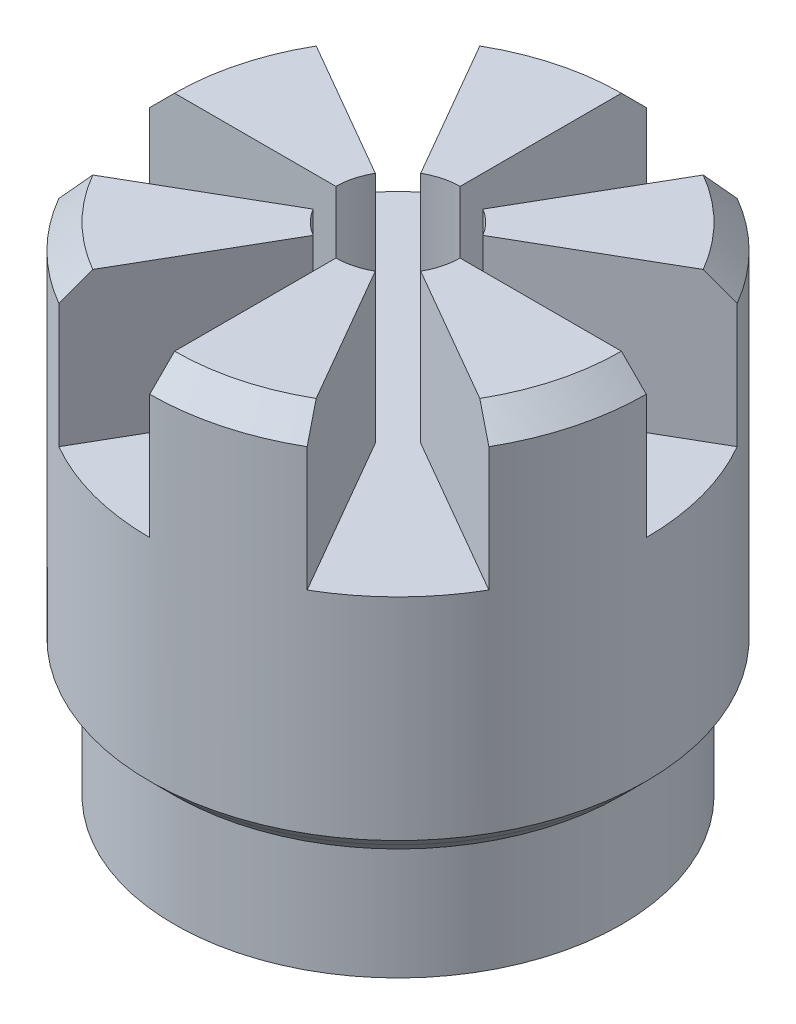
ISO-10303-21;
HEADER;
FILE_DESCRIPTION(('STEP AP214'),'2;1');
FILE_NAME('part.step','',(''),(''),'','','');
FILE_SCHEMA(('AUTOMOTIVE_DESIGN { 1 0 10303 214 1 1 1 1 }'));
ENDSEC;
DATA;
#1=APPLICATION_CONTEXT('core data for automotive mechanical design processes');
#2=APPLICATION_PROTOCOL_DEFINITION('international standard','automotive_design',2000,#1);
#3=PRODUCT_CONTEXT('',#1,'mechanical');
#4=PRODUCT('Part','Part','',(#3));
#5=PRODUCT_RELATED_PRODUCT_CATEGORY('part','',(#4));
#6=PRODUCT_DEFINITION_FORMATION('','',#4);
#7=PRODUCT_DEFINITION_CONTEXT('part definition',#1,'design');
#8=PRODUCT_DEFINITION('design','',#6,#7);
#9=PRODUCT_DEFINITION_SHAPE('','',#8);
#10=(LENGTH_UNIT() NAMED_UNIT(*) SI_UNIT(.MILLI.,.METRE.));
#11=(NAMED_UNIT(*) PLANE_ANGLE_UNIT() SI_UNIT($,.RADIAN.));
#12=(NAMED_UNIT(*) SI_UNIT($,.STERADIAN.) SOLID_ANGLE_UNIT());
#13=UNCERTAINTY_MEASURE_WITH_UNIT(LENGTH_MEASURE(1.E-05),#10,'distance_accuracy_value','');
#14=(GEOMETRIC_REPRESENTATION_CONTEXT(3) GLOBAL_UNCERTAINTY_ASSIGNED_CONTEXT((#13)) GLOBAL_UNIT_ASSIGNED_CONTEXT((#10,
#11,#12)) REPRESENTATION_CONTEXT('',''));
#15=CARTESIAN_POINT('',(0.,0.,0.));
#16=DIRECTION('',(0.,0.,1.));
#17=DIRECTION('',(1.,0.,0.));
#18=AXIS2_PLACEMENT_3D('',#15,#16,#17);
#19=CARTESIAN_POINT('',(0.,40.,0.));
#20=DIRECTION('',(0.,1.,0.));
#21=DIRECTION('',(-1.,0.,0.));
#22=AXIS2_PLACEMENT_3D('',#19,#20,#21);
#23=PLANE('',#22);
#24=CARTESIAN_POINT('',(0.,40.,0.));
#25=DIRECTION('',(0.,1.,0.));
#26=DIRECTION('',(-1.,0.,0.));
#27=AXIS2_PLACEMENT_3D('',#24,#25,#26);
#28=CIRCLE('',#27,5.);
#29=CARTESIAN_POINT('',(-4.33012701892222,40.,2.49999999999996));
#30=VERTEX_POINT('',#29);
#31=CARTESIAN_POINT('',(-2.49999999999997,40.,4.33012701892221));
#32=VERTEX_POINT('',#31);
#33=EDGE_CURVE('E241',#30,#32,#28,.T.);
#34=ORIENTED_EDGE('',*,*,#33,.F.);
#35=DIRECTION('',(-0.866025403784443,0.,0.499999999999992));
#36=VECTOR('',#35,1.);
#37=CARTESIAN_POINT('',(0.,40.,0.));
#38=LINE('',#37,#36);
#39=CARTESIAN_POINT('',(-15.58845726812,40.,8.99999999999985));
#40=VERTEX_POINT('',#39);
#41=EDGE_CURVE('E471',#30,#40,#38,.T.);
#42=ORIENTED_EDGE('',*,*,#41,.T.);
#43=CARTESIAN_POINT('',(0.,40.,0.));
#44=DIRECTION('',(0.,1.,0.));
#45=DIRECTION('',(-1.,0.,0.));
#46=AXIS2_PLACEMENT_3D('',#43,#44,#45);
#47=CIRCLE('',#46,18.);
#48=CARTESIAN_POINT('',(-8.9999999999999,40.,15.5884572681199));
#49=VERTEX_POINT('',#48);
#50=EDGE_CURVE('E464',#40,#49,#47,.T.);
#51=ORIENTED_EDGE('',*,*,#50,.T.);
#52=DIRECTION('',(0.499999999999995,0.,-0.866025403784442));
#53=VECTOR('',#52,1.);
#54=CARTESIAN_POINT('',(0.,40.,0.));
#55=LINE('',#54,#53);
#56=EDGE_CURVE('E455',#49,#32,#55,.T.);
#57=ORIENTED_EDGE('',*,*,#56,.T.);
#58=EDGE_LOOP('',(#34,#42,#51,#57));
#59=FACE_BOUND('',#58,.T.);
#60=ADVANCED_FACE('F32',(#59),#23,.T.);
#61=CARTESIAN_POINT('',(0.,40.,5.));
#62=VERTEX_POINT('',#61);
#63=CARTESIAN_POINT('',(2.50000000000001,40.,4.33012701892219));
#64=VERTEX_POINT('',#63);
#65=EDGE_CURVE('E657',#62,#64,#28,.T.);
#66=ORIENTED_EDGE('',*,*,#65,.F.);
#67=DIRECTION('',(0.,0.,1.));
#68=VECTOR('',#67,1.);
#69=CARTESIAN_POINT('',(0.,40.,0.));
#70=LINE('',#69,#68);
#71=CARTESIAN_POINT('',(0.,40.,18.));
#72=VERTEX_POINT('',#71);
#73=EDGE_CURVE('E257',#62,#72,#70,.T.);
#74=ORIENTED_EDGE('',*,*,#73,.T.);
#75=CARTESIAN_POINT('',(9.00000000000002,40.,15.5884572681199));
#76=VERTEX_POINT('',#75);
#77=EDGE_CURVE('E472',#72,#76,#47,.T.);
#78=ORIENTED_EDGE('',*,*,#77,.T.);
#79=DIRECTION('',(-0.500000000000001,0.,-0.866025403784438));
#80=VECTOR('',#79,1.);
#81=CARTESIAN_POINT('',(0.,40.,0.));
#82=LINE('',#81,#80);
#83=EDGE_CURVE('E56',#76,#64,#82,.T.);
#84=ORIENTED_EDGE('',*,*,#83,.T.);
#85=EDGE_LOOP('',(#66,#74,#78,#84));
#86=FACE_BOUND('',#85,.T.);
#87=ADVANCED_FACE('F372',(#86),#23,.T.);
#88=CARTESIAN_POINT('',(4.33012701892218,40.,2.50000000000002));
#89=VERTEX_POINT('',#88);
#90=CARTESIAN_POINT('',(5.,40.,0.));
#91=VERTEX_POINT('',#90);
#92=EDGE_CURVE('E656',#89,#91,#28,.T.);
#93=ORIENTED_EDGE('',*,*,#92,.F.);
#94=DIRECTION('',(0.866025403784436,0.,0.500000000000004));
#95=VECTOR('',#94,1.);
#96=CARTESIAN_POINT('',(0.,40.,0.));
#97=LINE('',#96,#95);
#98=CARTESIAN_POINT('',(15.5884572681198,40.,9.00000000000007));
#99=VERTEX_POINT('',#98);
#100=EDGE_CURVE('E443',#89,#99,#97,.T.);
#101=ORIENTED_EDGE('',*,*,#100,.T.);
#102=CARTESIAN_POINT('',(18.,40.,0.));
#103=VERTEX_POINT('',#102);
#104=EDGE_CURVE('E474',#99,#103,#47,.T.);
#105=ORIENTED_EDGE('',*,*,#104,.T.);
#106=DIRECTION('',(-1.,0.,0.));
#107=VECTOR('',#106,1.);
#108=CARTESIAN_POINT('',(0.,40.,0.));
#109=LINE('',#108,#107);
#110=EDGE_CURVE('E48',#103,#91,#109,.T.);
#111=ORIENTED_EDGE('',*,*,#110,.T.);
#112=EDGE_LOOP('',(#93,#101,#105,#111));
#113=FACE_BOUND('',#112,.T.);
#114=ADVANCED_FACE('F379',(#113),#23,.T.);
#115=CARTESIAN_POINT('',(4.3301270189222,40.,-2.49999999999999));
#116=VERTEX_POINT('',#115);
#117=CARTESIAN_POINT('',(2.49999999999997,40.,-4.33012701892221));
#118=VERTEX_POINT('',#117);
#119=EDGE_CURVE('E655',#116,#118,#28,.T.);
#120=ORIENTED_EDGE('',*,*,#119,.F.);
#121=DIRECTION('',(0.86602540378444,0.,-0.499999999999998));
#122=VECTOR('',#121,1.);
#123=CARTESIAN_POINT('',(0.,40.,0.));
#124=LINE('',#123,#122);
#125=CARTESIAN_POINT('',(15.5884572681199,40.,-8.99999999999996));
#126=VERTEX_POINT('',#125);
#127=EDGE_CURVE('E295',#116,#126,#124,.T.);
#128=ORIENTED_EDGE('',*,*,#127,.T.);
#129=CARTESIAN_POINT('',(8.9999999999999,40.,-15.5884572681199));
#130=VERTEX_POINT('',#129);
#131=EDGE_CURVE('E334',#126,#130,#47,.T.);
#132=ORIENTED_EDGE('',*,*,#131,.T.);
#133=DIRECTION('',(-0.499999999999995,0.,0.866025403784442));
#134=VECTOR('',#133,1.);
#135=CARTESIAN_POINT('',(0.,40.,0.));
#136=LINE('',#135,#134);
#137=EDGE_CURVE('E301',#130,#118,#136,.T.);
#138=ORIENTED_EDGE('',*,*,#137,.T.);
#139=EDGE_LOOP('',(#120,#128,#132,#138));
#140=FACE_BOUND('',#139,.T.);
#141=ADVANCED_FACE('F394',(#140),#23,.T.);
#142=CARTESIAN_POINT('',(0.,40.,-5.));
#143=VERTEX_POINT('',#142);
#144=CARTESIAN_POINT('',(-2.49999999999998,40.,-4.33012701892221));
#145=VERTEX_POINT('',#144);
#146=EDGE_CURVE('E407',#143,#145,#28,.T.);
#147=ORIENTED_EDGE('',*,*,#146,.F.);
#148=DIRECTION('',(0.,0.,-1.));
#149=VECTOR('',#148,1.);
#150=CARTESIAN_POINT('',(0.,40.,0.));
#151=LINE('',#150,#149);
#152=CARTESIAN_POINT('',(0.,40.,-18.));
#153=VERTEX_POINT('',#152);
#154=EDGE_CURVE('E306',#143,#153,#151,.T.);
#155=ORIENTED_EDGE('',*,*,#154,.T.);
#156=CARTESIAN_POINT('',(-8.9999999999999,40.,-15.5884572681199));
#157=VERTEX_POINT('',#156);
#158=EDGE_CURVE('E336',#153,#157,#47,.T.);
#159=ORIENTED_EDGE('',*,*,#158,.T.);
#160=DIRECTION('',(0.499999999999995,0.,0.866025403784441));
#161=VECTOR('',#160,1.);
#162=CARTESIAN_POINT('',(0.,40.,0.));
#163=LINE('',#162,#161);
#164=EDGE_CURVE('E535',#157,#145,#163,.T.);
#165=ORIENTED_EDGE('',*,*,#164,.T.);
#166=EDGE_LOOP('',(#147,#155,#159,#165));
#167=FACE_BOUND('',#166,.T.);
#168=ADVANCED_FACE('F386',(#167),#23,.T.);
#169=CARTESIAN_POINT('',(-4.33012701892216,40.,-2.50000000000005));
#170=VERTEX_POINT('',#169);
#171=CARTESIAN_POINT('',(-5.,40.,0.));
#172=VERTEX_POINT('',#171);
#173=EDGE_CURVE('E399',#170,#172,#28,.T.);
#174=ORIENTED_EDGE('',*,*,#173,.F.);
#175=DIRECTION('',(-0.866025403784433,0.,-0.50000000000001));
#176=VECTOR('',#175,1.);
#177=CARTESIAN_POINT('',(0.,40.,0.));
#178=LINE('',#177,#176);
#179=CARTESIAN_POINT('',(-15.5884572681198,40.,-9.00000000000018));
#180=VERTEX_POINT('',#179);
#181=EDGE_CURVE('E402',#170,#180,#178,.T.);
#182=ORIENTED_EDGE('',*,*,#181,.T.);
#183=CARTESIAN_POINT('',(-18.,40.,0.));
#184=VERTEX_POINT('',#183);
#185=EDGE_CURVE('E340',#180,#184,#47,.T.);
#186=ORIENTED_EDGE('',*,*,#185,.T.);
#187=DIRECTION('',(1.,0.,0.));
#188=VECTOR('',#187,1.);
#189=CARTESIAN_POINT('',(0.,40.,0.));
#190=LINE('',#189,#188);
#191=EDGE_CURVE('E404',#184,#172,#190,.T.);
#192=ORIENTED_EDGE('',*,*,#191,.T.);
#193=EDGE_LOOP('',(#174,#182,#186,#192));
#194=FACE_BOUND('',#193,.T.);
#195=ADVANCED_FACE('F375',(#194),#23,.T.);
#196=CARTESIAN_POINT('',(0.,24.,0.));
#197=DIRECTION('',(0.,-1.,0.));
#198=DIRECTION('',(1.,0.,0.));
#199=AXIS2_PLACEMENT_3D('',#196,#197,#198);
#200=CYLINDRICAL_SURFACE('',#199,20.);
#201=CARTESIAN_POINT('',(0.,11.,0.));
#202=DIRECTION('',(0.,-1.,0.));
#203=DIRECTION('',(1.,0.,0.));
#204=AXIS2_PLACEMENT_3D('',#201,#202,#203);
#205=CIRCLE('',#204,20.);
#206=CARTESIAN_POINT('',(20.,11.,0.));
#207=VERTEX_POINT('',#206);
#208=EDGE_CURVE('E349',#207,#207,#205,.F.);
#209=ORIENTED_EDGE('',*,*,#208,.T.);
#210=EDGE_LOOP('',(#209));
#211=FACE_BOUND('',#210,.T.);
#212=CARTESIAN_POINT('',(0.,38.,0.));
#213=DIRECTION('',(0.,1.,0.));
#214=DIRECTION('',(-1.,0.,0.));
#215=AXIS2_PLACEMENT_3D('',#212,#213,#214);
#216=CIRCLE('',#215,20.);
#217=CARTESIAN_POINT('',(20.,38.,0.));
#218=VERTEX_POINT('',#217);
#219=CARTESIAN_POINT('',(17.3205080756887,38.,10.0000000000001));
#220=VERTEX_POINT('',#219);
#221=EDGE_CURVE('E335',#218,#220,#216,.F.);
#222=ORIENTED_EDGE('',*,*,#221,.T.);
#223=DIRECTION('',(0.,-1.,0.));
#224=VECTOR('',#223,1.);
#225=CARTESIAN_POINT('',(17.3205080756887,24.,10.0000000000001));
#226=LINE('',#225,#224);
#227=CARTESIAN_POINT('',(17.3205080756887,28.,10.0000000000001));
#228=VERTEX_POINT('',#227);
#229=EDGE_CURVE('E276',#220,#228,#226,.T.);
#230=ORIENTED_EDGE('',*,*,#229,.T.);
#231=CARTESIAN_POINT('',(0.,28.,0.));
#232=DIRECTION('',(0.,1.,0.));
#233=DIRECTION('',(-0.866025403784436,0.,-0.500000000000004));
#234=AXIS2_PLACEMENT_3D('',#231,#232,#233);
#235=CIRCLE('',#234,20.);
#236=CARTESIAN_POINT('',(10.,28.,17.3205080756888));
#237=VERTEX_POINT('',#236);
#238=EDGE_CURVE('E271',#228,#237,#235,.F.);
#239=ORIENTED_EDGE('',*,*,#238,.T.);
#240=DIRECTION('',(0.,-1.,0.));
#241=VECTOR('',#240,1.);
#242=CARTESIAN_POINT('',(10.,24.,17.3205080756888));
#243=LINE('',#242,#241);
#244=CARTESIAN_POINT('',(10.,38.,17.3205080756888));
#245=VERTEX_POINT('',#244);
#246=EDGE_CURVE('E435',#237,#245,#243,.F.);
#247=ORIENTED_EDGE('',*,*,#246,.T.);
#248=CARTESIAN_POINT('',(0.,38.,20.));
#249=VERTEX_POINT('',#248);
#250=EDGE_CURVE('E551',#245,#249,#216,.F.);
#251=ORIENTED_EDGE('',*,*,#250,.T.);
#252=DIRECTION('',(0.,-1.,0.));
#253=VECTOR('',#252,1.);
#254=CARTESIAN_POINT('',(0.,24.,20.));
#255=LINE('',#254,#253);
#256=CARTESIAN_POINT('',(0.,28.,20.));
#257=VERTEX_POINT('',#256);
#258=EDGE_CURVE('E269',#249,#257,#255,.T.);
#259=ORIENTED_EDGE('',*,*,#258,.T.);
#260=CARTESIAN_POINT('',(0.,28.,0.));
#261=DIRECTION('',(0.,1.,0.));
#262=DIRECTION('',(0.,0.,-1.));
#263=AXIS2_PLACEMENT_3D('',#260,#261,#262);
#264=CIRCLE('',#263,20.);
#265=CARTESIAN_POINT('',(-9.99999999999989,28.,17.3205080756888));
#266=VERTEX_POINT('',#265);
#267=EDGE_CURVE('E249',#257,#266,#264,.F.);
#268=ORIENTED_EDGE('',*,*,#267,.T.);
#269=DIRECTION('',(0.,-1.,0.));
#270=VECTOR('',#269,1.);
#271=CARTESIAN_POINT('',(-9.99999999999989,24.,17.3205080756888));
#272=LINE('',#271,#270);
#273=CARTESIAN_POINT('',(-9.99999999999989,38.,17.3205080756888));
#274=VERTEX_POINT('',#273);
#275=EDGE_CURVE('E259',#266,#274,#272,.F.);
#276=ORIENTED_EDGE('',*,*,#275,.T.);
#277=CARTESIAN_POINT('',(-17.3205080756889,38.,9.99999999999983));
#278=VERTEX_POINT('',#277);
#279=EDGE_CURVE('E466',#274,#278,#216,.F.);
#280=ORIENTED_EDGE('',*,*,#279,.T.);
#281=DIRECTION('',(0.,-1.,0.));
#282=VECTOR('',#281,1.);
#283=CARTESIAN_POINT('',(-17.3205080756889,24.,9.99999999999984));
#284=LINE('',#283,#282);
#285=CARTESIAN_POINT('',(-17.3205080756889,28.,9.99999999999984));
#286=VERTEX_POINT('',#285);
#287=EDGE_CURVE('E448',#278,#286,#284,.T.);
#288=ORIENTED_EDGE('',*,*,#287,.T.);
#289=CARTESIAN_POINT('',(0.,28.,0.));
#290=DIRECTION('',(0.,1.,0.));
#291=DIRECTION('',(0.866025403784443,0.,-0.499999999999992));
#292=AXIS2_PLACEMENT_3D('',#289,#290,#291);
#293=CIRCLE('',#292,20.);
#294=CARTESIAN_POINT('',(-20.,28.,0.));
#295=VERTEX_POINT('',#294);
#296=EDGE_CURVE('E419',#286,#295,#293,.F.);
#297=ORIENTED_EDGE('',*,*,#296,.T.);
#298=DIRECTION('',(0.,-1.,0.));
#299=VECTOR('',#298,1.);
#300=CARTESIAN_POINT('',(-20.,24.,0.));
#301=LINE('',#300,#299);
#302=CARTESIAN_POINT('',(-20.,38.,0.));
#303=VERTEX_POINT('',#302);
#304=EDGE_CURVE('E514',#295,#303,#301,.F.);
#305=ORIENTED_EDGE('',*,*,#304,.T.);
#306=CARTESIAN_POINT('',(-17.3205080756887,38.,-10.0000000000002));
#307=VERTEX_POINT('',#306);
#308=EDGE_CURVE('E548',#303,#307,#216,.F.);
#309=ORIENTED_EDGE('',*,*,#308,.T.);
#310=DIRECTION('',(0.,-1.,0.));
#311=VECTOR('',#310,1.);
#312=CARTESIAN_POINT('',(-17.3205080756887,24.,-10.0000000000002));
#313=LINE('',#312,#311);
#314=CARTESIAN_POINT('',(-17.3205080756887,28.,-10.0000000000002));
#315=VERTEX_POINT('',#314);
#316=EDGE_CURVE('E416',#307,#315,#313,.T.);
#317=ORIENTED_EDGE('',*,*,#316,.T.);
#318=CARTESIAN_POINT('',(0.,28.,0.));
#319=DIRECTION('',(0.,1.,0.));
#320=DIRECTION('',(0.866025403784433,0.,0.50000000000001));
#321=AXIS2_PLACEMENT_3D('',#318,#319,#320);
#322=CIRCLE('',#321,20.);
#323=CARTESIAN_POINT('',(-9.9999999999999,28.,-17.3205080756888));
#324=VERTEX_POINT('',#323);
#325=EDGE_CURVE('E524',#315,#324,#322,.F.);
#326=ORIENTED_EDGE('',*,*,#325,.T.);
#327=DIRECTION('',(0.,-1.,0.));
#328=VECTOR('',#327,1.);
#329=CARTESIAN_POINT('',(-9.9999999999999,24.,-17.3205080756888));
#330=LINE('',#329,#328);
#331=CARTESIAN_POINT('',(-9.9999999999999,38.,-17.3205080756888));
#332=VERTEX_POINT('',#331);
#333=EDGE_CURVE('E541',#324,#332,#330,.F.);
#334=ORIENTED_EDGE('',*,*,#333,.T.);
#335=CARTESIAN_POINT('',(0.,38.,-20.));
#336=VERTEX_POINT('',#335);
#337=EDGE_CURVE('E330',#332,#336,#216,.F.);
#338=ORIENTED_EDGE('',*,*,#337,.T.);
#339=DIRECTION('',(0.,-1.,0.));
#340=VECTOR('',#339,1.);
#341=CARTESIAN_POINT('',(0.,24.,-20.));
#342=LINE('',#341,#340);
#343=CARTESIAN_POINT('',(0.,28.,-20.));
#344=VERTEX_POINT('',#343);
#345=EDGE_CURVE('E321',#336,#344,#342,.T.);
#346=ORIENTED_EDGE('',*,*,#345,.T.);
#347=CARTESIAN_POINT('',(0.,28.,0.));
#348=DIRECTION('',(0.,1.,0.));
#349=DIRECTION('',(0.,0.,1.));
#350=AXIS2_PLACEMENT_3D('',#347,#348,#349);
#351=CIRCLE('',#350,20.);
#352=CARTESIAN_POINT('',(9.99999999999989,28.,-17.3205080756888));
#353=VERTEX_POINT('',#352);
#354=EDGE_CURVE('E346',#344,#353,#351,.F.);
#355=ORIENTED_EDGE('',*,*,#354,.T.);
#356=DIRECTION('',(0.,-1.,0.));
#357=VECTOR('',#356,1.);
#358=CARTESIAN_POINT('',(9.99999999999989,24.,-17.3205080756888));
#359=LINE('',#358,#357);
#360=CARTESIAN_POINT('',(9.99999999999989,38.,-17.3205080756888));
#361=VERTEX_POINT('',#360);
#362=EDGE_CURVE('E316',#353,#361,#359,.F.);
#363=ORIENTED_EDGE('',*,*,#362,.T.);
#364=CARTESIAN_POINT('',(17.3205080756888,38.,-9.99999999999996));
#365=VERTEX_POINT('',#364);
#366=EDGE_CURVE('E331',#361,#365,#216,.F.);
#367=ORIENTED_EDGE('',*,*,#366,.T.);
#368=DIRECTION('',(0.,-1.,0.));
#369=VECTOR('',#368,1.);
#370=CARTESIAN_POINT('',(17.3205080756888,24.,-9.99999999999996));
#371=LINE('',#370,#369);
#372=CARTESIAN_POINT('',(17.3205080756888,28.,-9.99999999999996));
#373=VERTEX_POINT('',#372);
#374=EDGE_CURVE('E298',#365,#373,#371,.T.);
#375=ORIENTED_EDGE('',*,*,#374,.T.);
#376=CARTESIAN_POINT('',(0.,28.,0.));
#377=DIRECTION('',(0.,1.,0.));
#378=DIRECTION('',(-0.86602540378444,0.,0.499999999999998));
#379=AXIS2_PLACEMENT_3D('',#376,#377,#378);
#380=CIRCLE('',#379,20.);
#381=CARTESIAN_POINT('',(20.,28.,0.));
#382=VERTEX_POINT('',#381);
#383=EDGE_CURVE('E272',#373,#382,#380,.F.);
#384=ORIENTED_EDGE('',*,*,#383,.T.);
#385=DIRECTION('',(0.,-1.,0.));
#386=VECTOR('',#385,1.);
#387=CARTESIAN_POINT('',(20.,24.,0.));
#388=LINE('',#387,#386);
#389=EDGE_CURVE('E287',#382,#218,#388,.F.);
#390=ORIENTED_EDGE('',*,*,#389,.T.);
#391=EDGE_LOOP('',(#222,#230,#239,#247,#251,#259,#268,#276,#280,#288,#297,#305,#309,#317,#326,
#334,#338,#346,#355,#363,#367,#375,#384,#390));
#392=FACE_BOUND('',#391,.T.);
#393=ADVANCED_FACE('F385',(#211,#392),#200,.T.);
#394=CARTESIAN_POINT('',(0.,38.,0.));
#395=DIRECTION('',(0.,-1.,0.));
#396=DIRECTION('',(1.,0.,0.));
#397=AXIS2_PLACEMENT_3D('',#394,#395,#396);
#398=CONICAL_SURFACE('',#397,20.,0.785398163397452);
#399=ORIENTED_EDGE('',*,*,#104,.F.);
#400=DIRECTION('',(-0.612372435695795,0.707106781186545,-0.353553390593278));
#401=VECTOR('',#400,1.);
#402=CARTESIAN_POINT('',(0.,57.9999999999999,0.));
#403=LINE('',#402,#401);
#404=EDGE_CURVE('E440',#99,#220,#403,.F.);
#405=ORIENTED_EDGE('',*,*,#404,.T.);
#406=ORIENTED_EDGE('',*,*,#221,.F.);
#407=DIRECTION('',(0.70710678118655,-0.707106781186545,0.));
#408=VECTOR('',#407,1.);
#409=CARTESIAN_POINT('',(0.,57.9999999999999,0.));
#410=LINE('',#409,#408);
#411=EDGE_CURVE('E285',#218,#103,#410,.F.);
#412=ORIENTED_EDGE('',*,*,#411,.T.);
#413=EDGE_LOOP('',(#399,#405,#406,#412));
#414=FACE_BOUND('',#413,.T.);
#415=ADVANCED_FACE('F392',(#414),#398,.T.);
#416=ORIENTED_EDGE('',*,*,#250,.F.);
#417=DIRECTION('',(0.353553390593276,-0.707106781186545,0.612372435695796));
#418=VECTOR('',#417,1.);
#419=CARTESIAN_POINT('',(0.,57.9999999999999,0.));
#420=LINE('',#419,#418);
#421=EDGE_CURVE('E433',#245,#76,#420,.F.);
#422=ORIENTED_EDGE('',*,*,#421,.T.);
#423=ORIENTED_EDGE('',*,*,#77,.F.);
#424=DIRECTION('',(0.,0.707106781186545,-0.70710678118655));
#425=VECTOR('',#424,1.);
#426=CARTESIAN_POINT('',(0.,57.9999999999999,0.));
#427=LINE('',#426,#425);
#428=EDGE_CURVE('E258',#72,#249,#427,.F.);
#429=ORIENTED_EDGE('',*,*,#428,.T.);
#430=EDGE_LOOP('',(#416,#422,#423,#429));
#431=FACE_BOUND('',#430,.T.);
#432=ADVANCED_FACE('F629',(#431),#398,.T.);
#433=ORIENTED_EDGE('',*,*,#279,.F.);
#434=DIRECTION('',(-0.353553390593271,-0.707106781186545,0.612372435695799));
#435=VECTOR('',#434,1.);
#436=CARTESIAN_POINT('',(0.,57.9999999999999,0.));
#437=LINE('',#436,#435);
#438=EDGE_CURVE('E264',#274,#49,#437,.F.);
#439=ORIENTED_EDGE('',*,*,#438,.T.);
#440=ORIENTED_EDGE('',*,*,#50,.F.);
#441=DIRECTION('',(0.6123724356958,0.707106781186545,-0.353553390593269));
#442=VECTOR('',#441,1.);
#443=CARTESIAN_POINT('',(0.,57.9999999999999,0.));
#444=LINE('',#443,#442);
#445=EDGE_CURVE('E519',#40,#278,#444,.F.);
#446=ORIENTED_EDGE('',*,*,#445,.T.);
#447=EDGE_LOOP('',(#433,#439,#440,#446));
#448=FACE_BOUND('',#447,.T.);
#449=ADVANCED_FACE('F462',(#448),#398,.T.);
#450=ORIENTED_EDGE('',*,*,#308,.F.);
#451=DIRECTION('',(-0.70710678118655,-0.707106781186545,0.));
#452=VECTOR('',#451,1.);
#453=CARTESIAN_POINT('',(0.,57.9999999999999,0.));
#454=LINE('',#453,#452);
#455=EDGE_CURVE('E511',#303,#184,#454,.F.);
#456=ORIENTED_EDGE('',*,*,#455,.T.);
#457=ORIENTED_EDGE('',*,*,#185,.F.);
#458=DIRECTION('',(0.612372435695793,0.707106781186545,0.353553390593282));
#459=VECTOR('',#458,1.);
#460=CARTESIAN_POINT('',(0.,57.9999999999999,0.));
#461=LINE('',#460,#459);
#462=EDGE_CURVE('E415',#180,#307,#461,.F.);
#463=ORIENTED_EDGE('',*,*,#462,.T.);
#464=EDGE_LOOP('',(#450,#456,#457,#463));
#465=FACE_BOUND('',#464,.T.);
#466=ADVANCED_FACE('F860',(#465),#398,.T.);
#467=ORIENTED_EDGE('',*,*,#337,.F.);
#468=DIRECTION('',(-0.353553390593272,-0.707106781186545,-0.612372435695799));
#469=VECTOR('',#468,1.);
#470=CARTESIAN_POINT('',(0.,57.9999999999999,0.));
#471=LINE('',#470,#469);
#472=EDGE_CURVE('E538',#332,#157,#471,.F.);
#473=ORIENTED_EDGE('',*,*,#472,.T.);
#474=ORIENTED_EDGE('',*,*,#158,.F.);
#475=DIRECTION('',(0.,0.707106781186545,0.70710678118655));
#476=VECTOR('',#475,1.);
#477=CARTESIAN_POINT('',(0.,57.9999999999999,0.));
#478=LINE('',#477,#476);
#479=EDGE_CURVE('E343',#153,#336,#478,.F.);
#480=ORIENTED_EDGE('',*,*,#479,.T.);
#481=EDGE_LOOP('',(#467,#473,#474,#480));
#482=FACE_BOUND('',#481,.T.);
#483=ADVANCED_FACE('F561',(#482),#398,.T.);
#484=ORIENTED_EDGE('',*,*,#131,.F.);
#485=DIRECTION('',(-0.612372435695797,0.707106781186545,0.353553390593274));
#486=VECTOR('',#485,1.);
#487=CARTESIAN_POINT('',(0.,57.9999999999999,0.));
#488=LINE('',#487,#486);
#489=EDGE_CURVE('E292',#126,#365,#488,.F.);
#490=ORIENTED_EDGE('',*,*,#489,.T.);
#491=ORIENTED_EDGE('',*,*,#366,.F.);
#492=DIRECTION('',(0.353553390593271,-0.707106781186545,-0.612372435695799));
#493=VECTOR('',#492,1.);
#494=CARTESIAN_POINT('',(0.,57.9999999999999,0.));
#495=LINE('',#494,#493);
#496=EDGE_CURVE('E339',#361,#130,#495,.F.);
#497=ORIENTED_EDGE('',*,*,#496,.T.);
#498=EDGE_LOOP('',(#484,#490,#491,#497));
#499=FACE_BOUND('',#498,.T.);
#500=ADVANCED_FACE('F488',(#499),#398,.T.);
#501=CARTESIAN_POINT('',(18.,0.,0.));
#502=DIRECTION('',(0.,-1.,0.));
#503=DIRECTION('',(1.,0.,0.));
#504=AXIS2_PLACEMENT_3D('',#501,#502,#503);
#505=PLANE('',#504);
#506=CARTESIAN_POINT('',(0.,0.,0.));
#507=DIRECTION('',(0.,-1.,0.));
#508=DIRECTION('',(1.,0.,0.));
#509=AXIS2_PLACEMENT_3D('',#506,#507,#508);
#510=CIRCLE('',#509,13.);
#511=CARTESIAN_POINT('',(13.,0.,0.));
#512=VERTEX_POINT('',#511);
#513=EDGE_CURVE('E11',#512,#512,#510,.F.);
#514=ORIENTED_EDGE('',*,*,#513,.T.);
#515=EDGE_LOOP('',(#514));
#516=FACE_BOUND('',#515,.T.);
#517=CARTESIAN_POINT('',(0.,0.,0.));
#518=DIRECTION('',(0.,-1.,0.));
#519=DIRECTION('',(1.,0.,0.));
#520=AXIS2_PLACEMENT_3D('',#517,#518,#519);
#521=CIRCLE('',#520,18.);
#522=CARTESIAN_POINT('',(18.,0.,0.));
#523=VERTEX_POINT('',#522);
#524=EDGE_CURVE('E324',#523,#523,#521,.T.);
#525=ORIENTED_EDGE('',*,*,#524,.T.);
#526=EDGE_LOOP('',(#525));
#527=FACE_BOUND('',#526,.T.);
#528=ADVANCED_FACE('F618',(#516,#527),#505,.T.);
#529=CARTESIAN_POINT('',(0.,24.,0.));
#530=DIRECTION('',(0.,-1.,0.));
#531=DIRECTION('',(1.,0.,0.));
#532=AXIS2_PLACEMENT_3D('',#529,#530,#531);
#533=CYLINDRICAL_SURFACE('',#532,12.);
#534=CARTESIAN_POINT('',(0.,0.999999999999997,0.));
#535=DIRECTION('',(0.,-1.,0.));
#536=DIRECTION('',(1.,0.,0.));
#537=AXIS2_PLACEMENT_3D('',#534,#535,#536);
#538=CIRCLE('',#537,12.);
#539=CARTESIAN_POINT('',(12.,0.999999999999997,0.));
#540=VERTEX_POINT('',#539);
#541=EDGE_CURVE('E41',#540,#540,#538,.T.);
#542=ORIENTED_EDGE('',*,*,#541,.T.);
#543=EDGE_LOOP('',(#542));
#544=FACE_BOUND('',#543,.T.);
#545=CARTESIAN_POINT('',(0.,24.,0.));
#546=DIRECTION('',(0.,-1.,0.));
#547=DIRECTION('',(1.,0.,0.));
#548=AXIS2_PLACEMENT_3D('',#545,#546,#547);
#549=CIRCLE('',#548,12.);
#550=CARTESIAN_POINT('',(12.,24.,0.));
#551=VERTEX_POINT('',#550);
#552=EDGE_CURVE('E327',#551,#551,#549,.T.);
#553=ORIENTED_EDGE('',*,*,#552,.F.);
#554=EDGE_LOOP('',(#553));
#555=FACE_BOUND('',#554,.T.);
#556=ADVANCED_FACE('F358',(#544,#555),#533,.F.);
#557=CARTESIAN_POINT('',(12.,24.,0.));
#558=DIRECTION('',(0.,-1.,0.));
#559=DIRECTION('',(1.,0.,0.));
#560=AXIS2_PLACEMENT_3D('',#557,#558,#559);
#561=PLANE('',#560);
#562=ORIENTED_EDGE('',*,*,#552,.T.);
#563=EDGE_LOOP('',(#562));
#564=FACE_BOUND('',#563,.T.);
#565=ADVANCED_FACE('F608',(#564),#561,.T.);
#566=CARTESIAN_POINT('',(0.,24.,0.));
#567=DIRECTION('',(0.,-1.,0.));
#568=DIRECTION('',(1.,0.,0.));
#569=AXIS2_PLACEMENT_3D('',#566,#567,#568);
#570=CYLINDRICAL_SURFACE('',#569,18.);
#571=CARTESIAN_POINT('',(0.,8.99999999999999,0.));
#572=DIRECTION('',(0.,-1.,0.));
#573=DIRECTION('',(1.,0.,0.));
#574=AXIS2_PLACEMENT_3D('',#571,#572,#573);
#575=CIRCLE('',#574,18.);
#576=CARTESIAN_POINT('',(18.,8.99999999999999,0.));
#577=VERTEX_POINT('',#576);
#578=EDGE_CURVE('E352',#577,#577,#575,.T.);
#579=ORIENTED_EDGE('',*,*,#578,.T.);
#580=EDGE_LOOP('',(#579));
#581=FACE_BOUND('',#580,.T.);
#582=ORIENTED_EDGE('',*,*,#524,.F.);
#583=EDGE_LOOP('',(#582));
#584=FACE_BOUND('',#583,.T.);
#585=ADVANCED_FACE('F604',(#581,#584),#570,.T.);
#586=CARTESIAN_POINT('',(0.,28.,0.));
#587=DIRECTION('',(1.,0.,0.));
#588=DIRECTION('',(0.,1.,0.));
#589=AXIS2_PLACEMENT_3D('',#586,#587,#588);
#590=PLANE('',#589);
#591=ORIENTED_EDGE('',*,*,#479,.F.);
#592=ORIENTED_EDGE('',*,*,#154,.F.);
#593=DIRECTION('',(0.,1.,0.));
#594=VECTOR('',#593,1.);
#595=CARTESIAN_POINT('',(0.,28.,-5.));
#596=LINE('',#595,#594);
#597=CARTESIAN_POINT('',(0.,28.,-5.));
#598=VERTEX_POINT('',#597);
#599=EDGE_CURVE('E314',#598,#143,#596,.T.);
#600=ORIENTED_EDGE('',*,*,#599,.F.);
#601=DIRECTION('',(0.,0.,-1.));
#602=VECTOR('',#601,1.);
#603=CARTESIAN_POINT('',(0.,28.,0.));
#604=LINE('',#603,#602);
#605=EDGE_CURVE('E305',#598,#344,#604,.T.);
#606=ORIENTED_EDGE('',*,*,#605,.T.);
#607=ORIENTED_EDGE('',*,*,#345,.F.);
#608=EDGE_LOOP('',(#591,#592,#600,#606,#607));
#609=FACE_BOUND('',#608,.T.);
#610=ADVANCED_FACE('F557',(#609),#590,.T.);
#611=CARTESIAN_POINT('',(0.,28.,0.));
#612=DIRECTION('',(-0.866025403784442,0.,-0.499999999999995));
#613=DIRECTION('',(-0.499999999999995,0.,0.866025403784442));
#614=AXIS2_PLACEMENT_3D('',#611,#612,#613);
#615=PLANE('',#614);
#616=DIRECTION('',(-0.499999999999995,0.,0.866025403784442));
#617=VECTOR('',#616,1.);
#618=CARTESIAN_POINT('',(0.,28.,0.));
#619=LINE('',#618,#617);
#620=CARTESIAN_POINT('',(2.49999999999997,28.,-4.33012701892221));
#621=VERTEX_POINT('',#620);
#622=EDGE_CURVE('E302',#353,#621,#619,.T.);
#623=ORIENTED_EDGE('',*,*,#622,.T.);
#624=DIRECTION('',(0.,1.,0.));
#625=VECTOR('',#624,1.);
#626=CARTESIAN_POINT('',(2.49999999999997,28.,-4.33012701892221));
#627=LINE('',#626,#625);
#628=EDGE_CURVE('E309',#621,#118,#627,.T.);
#629=ORIENTED_EDGE('',*,*,#628,.T.);
#630=ORIENTED_EDGE('',*,*,#137,.F.);
#631=ORIENTED_EDGE('',*,*,#496,.F.);
#632=ORIENTED_EDGE('',*,*,#362,.F.);
#633=EDGE_LOOP('',(#623,#629,#630,#631,#632));
#634=FACE_BOUND('',#633,.T.);
#635=ADVANCED_FACE('F486',(#634),#615,.T.);
#636=CARTESIAN_POINT('',(0.,28.,0.));
#637=DIRECTION('',(0.,1.,0.));
#638=DIRECTION('',(0.,0.,1.));
#639=AXIS2_PLACEMENT_3D('',#636,#637,#638);
#640=PLANE('',#639);
#641=ORIENTED_EDGE('',*,*,#605,.F.);
#642=CARTESIAN_POINT('',(0.,28.,0.));
#643=DIRECTION('',(0.,1.,0.));
#644=DIRECTION('',(0.,0.,1.));
#645=AXIS2_PLACEMENT_3D('',#642,#643,#644);
#646=CIRCLE('',#645,5.);
#647=CARTESIAN_POINT('',(-2.49999999999998,28.,-4.33012701892221));
#648=VERTEX_POINT('',#647);
#649=EDGE_CURVE('E497',#648,#598,#646,.F.);
#650=ORIENTED_EDGE('',*,*,#649,.F.);
#651=DIRECTION('',(0.499999999999995,0.,0.866025403784441));
#652=VECTOR('',#651,1.);
#653=CARTESIAN_POINT('',(0.,28.,0.));
#654=LINE('',#653,#652);
#655=EDGE_CURVE('E529',#324,#648,#654,.T.);
#656=ORIENTED_EDGE('',*,*,#655,.F.);
#657=ORIENTED_EDGE('',*,*,#325,.F.);
#658=DIRECTION('',(-0.866025403784433,0.,-0.50000000000001));
#659=VECTOR('',#658,1.);
#660=CARTESIAN_POINT('',(0.,28.,0.));
#661=LINE('',#660,#659);
#662=CARTESIAN_POINT('',(-4.33012701892216,28.,-2.50000000000005));
#663=VERTEX_POINT('',#662);
#664=EDGE_CURVE('E527',#663,#315,#661,.T.);
#665=ORIENTED_EDGE('',*,*,#664,.F.);
#666=CARTESIAN_POINT('',(-5.,28.,0.));
#667=VERTEX_POINT('',#666);
#668=EDGE_CURVE('E498',#667,#663,#646,.F.);
#669=ORIENTED_EDGE('',*,*,#668,.F.);
#670=DIRECTION('',(1.,0.,0.));
#671=VECTOR('',#670,1.);
#672=CARTESIAN_POINT('',(0.,28.,0.));
#673=LINE('',#672,#671);
#674=EDGE_CURVE('E505',#295,#667,#673,.T.);
#675=ORIENTED_EDGE('',*,*,#674,.F.);
#676=ORIENTED_EDGE('',*,*,#296,.F.);
#677=DIRECTION('',(-0.866025403784443,0.,0.499999999999992));
#678=VECTOR('',#677,1.);
#679=CARTESIAN_POINT('',(0.,28.,0.));
#680=LINE('',#679,#678);
#681=CARTESIAN_POINT('',(-4.33012701892222,28.,2.49999999999996));
#682=VERTEX_POINT('',#681);
#683=EDGE_CURVE('E502',#682,#286,#680,.T.);
#684=ORIENTED_EDGE('',*,*,#683,.F.);
#685=CARTESIAN_POINT('',(-2.49999999999997,28.,4.33012701892221));
#686=VERTEX_POINT('',#685);
#687=EDGE_CURVE('E243',#686,#682,#646,.F.);
#688=ORIENTED_EDGE('',*,*,#687,.F.);
#689=DIRECTION('',(0.499999999999995,0.,-0.866025403784442));
#690=VECTOR('',#689,1.);
#691=CARTESIAN_POINT('',(0.,28.,0.));
#692=LINE('',#691,#690);
#693=EDGE_CURVE('E252',#266,#686,#692,.T.);
#694=ORIENTED_EDGE('',*,*,#693,.F.);
#695=ORIENTED_EDGE('',*,*,#267,.F.);
#696=DIRECTION('',(0.,0.,1.));
#697=VECTOR('',#696,1.);
#698=CARTESIAN_POINT('',(0.,28.,0.));
#699=LINE('',#698,#697);
#700=CARTESIAN_POINT('',(0.,28.,5.));
#701=VERTEX_POINT('',#700);
#702=EDGE_CURVE('E245',#701,#257,#699,.T.);
#703=ORIENTED_EDGE('',*,*,#702,.F.);
#704=CARTESIAN_POINT('',(2.50000000000001,28.,4.33012701892219));
#705=VERTEX_POINT('',#704);
#706=EDGE_CURVE('E231',#705,#701,#646,.F.);
#707=ORIENTED_EDGE('',*,*,#706,.F.);
#708=DIRECTION('',(-0.500000000000001,0.,-0.866025403784438));
#709=VECTOR('',#708,1.);
#710=CARTESIAN_POINT('',(0.,28.,0.));
#711=LINE('',#710,#709);
#712=EDGE_CURVE('E429',#237,#705,#711,.T.);
#713=ORIENTED_EDGE('',*,*,#712,.F.);
#714=ORIENTED_EDGE('',*,*,#238,.F.);
#715=DIRECTION('',(0.866025403784436,0.,0.500000000000004));
#716=VECTOR('',#715,1.);
#717=CARTESIAN_POINT('',(0.,28.,0.));
#718=LINE('',#717,#716);
#719=CARTESIAN_POINT('',(4.33012701892218,28.,2.50000000000002));
#720=VERTEX_POINT('',#719);
#721=EDGE_CURVE('E426',#720,#228,#718,.T.);
#722=ORIENTED_EDGE('',*,*,#721,.F.);
#723=CARTESIAN_POINT('',(5.,28.,0.));
#724=VERTEX_POINT('',#723);
#725=EDGE_CURVE('E240',#724,#720,#646,.F.);
#726=ORIENTED_EDGE('',*,*,#725,.F.);
#727=DIRECTION('',(-1.,0.,0.));
#728=VECTOR('',#727,1.);
#729=CARTESIAN_POINT('',(0.,28.,0.));
#730=LINE('',#729,#728);
#731=EDGE_CURVE('E279',#382,#724,#730,.T.);
#732=ORIENTED_EDGE('',*,*,#731,.F.);
#733=ORIENTED_EDGE('',*,*,#383,.F.);
#734=DIRECTION('',(0.86602540378444,0.,-0.499999999999998));
#735=VECTOR('',#734,1.);
#736=CARTESIAN_POINT('',(0.,28.,0.));
#737=LINE('',#736,#735);
#738=CARTESIAN_POINT('',(4.3301270189222,28.,-2.49999999999999));
#739=VERTEX_POINT('',#738);
#740=EDGE_CURVE('E275',#739,#373,#737,.T.);
#741=ORIENTED_EDGE('',*,*,#740,.F.);
#742=EDGE_CURVE('E494',#621,#739,#646,.F.);
#743=ORIENTED_EDGE('',*,*,#742,.F.);
#744=ORIENTED_EDGE('',*,*,#622,.F.);
#745=ORIENTED_EDGE('',*,*,#354,.F.);
#746=EDGE_LOOP('',(#641,#650,#656,#657,#665,#669,#675,#676,#684,#688,#694,#695,#703,#707,#713,
#714,#722,#726,#732,#733,#741,#743,#744,#745));
#747=FACE_BOUND('',#746,.T.);
#748=ADVANCED_FACE('F247',(#747),#640,.T.);
#749=CARTESIAN_POINT('',(0.,28.,0.));
#750=DIRECTION('',(0.499999999999998,0.,0.86602540378444));
#751=DIRECTION('',(0.,1.,0.));
#752=AXIS2_PLACEMENT_3D('',#749,#750,#751);
#753=PLANE('',#752);
#754=ORIENTED_EDGE('',*,*,#489,.F.);
#755=ORIENTED_EDGE('',*,*,#127,.F.);
#756=DIRECTION('',(0.,1.,0.));
#757=VECTOR('',#756,1.);
#758=CARTESIAN_POINT('',(4.3301270189222,28.,-2.49999999999999));
#759=LINE('',#758,#757);
#760=EDGE_CURVE('E290',#739,#116,#759,.T.);
#761=ORIENTED_EDGE('',*,*,#760,.F.);
#762=ORIENTED_EDGE('',*,*,#740,.T.);
#763=ORIENTED_EDGE('',*,*,#374,.F.);
#764=EDGE_LOOP('',(#754,#755,#761,#762,#763));
#765=FACE_BOUND('',#764,.T.);
#766=ADVANCED_FACE('F596',(#765),#753,.T.);
#767=CARTESIAN_POINT('',(0.,28.,0.));
#768=DIRECTION('',(0.,0.,-1.));
#769=DIRECTION('',(-1.,0.,0.));
#770=AXIS2_PLACEMENT_3D('',#767,#768,#769);
#771=PLANE('',#770);
#772=ORIENTED_EDGE('',*,*,#731,.T.);
#773=DIRECTION('',(0.,1.,0.));
#774=VECTOR('',#773,1.);
#775=CARTESIAN_POINT('',(5.,28.,0.));
#776=LINE('',#775,#774);
#777=EDGE_CURVE('E282',#724,#91,#776,.T.);
#778=ORIENTED_EDGE('',*,*,#777,.T.);
#779=ORIENTED_EDGE('',*,*,#110,.F.);
#780=ORIENTED_EDGE('',*,*,#411,.F.);
#781=ORIENTED_EDGE('',*,*,#389,.F.);
#782=EDGE_LOOP('',(#772,#778,#779,#780,#781));
#783=FACE_BOUND('',#782,.T.);
#784=ADVANCED_FACE('F578',(#783),#771,.T.);
#785=CARTESIAN_POINT('',(0.,28.,0.));
#786=DIRECTION('',(0.50000000000001,0.,-0.866025403784433));
#787=DIRECTION('',(0.,1.,0.));
#788=AXIS2_PLACEMENT_3D('',#785,#786,#787);
#789=PLANE('',#788);
#790=ORIENTED_EDGE('',*,*,#462,.F.);
#791=ORIENTED_EDGE('',*,*,#181,.F.);
#792=DIRECTION('',(0.,1.,0.));
#793=VECTOR('',#792,1.);
#794=CARTESIAN_POINT('',(-4.33012701892216,28.,-2.50000000000005));
#795=LINE('',#794,#793);
#796=EDGE_CURVE('E413',#663,#170,#795,.T.);
#797=ORIENTED_EDGE('',*,*,#796,.F.);
#798=ORIENTED_EDGE('',*,*,#664,.T.);
#799=ORIENTED_EDGE('',*,*,#316,.F.);
#800=EDGE_LOOP('',(#790,#791,#797,#798,#799));
#801=FACE_BOUND('',#800,.T.);
#802=ADVANCED_FACE('F411',(#801),#789,.T.);
#803=CARTESIAN_POINT('',(0.,28.,0.));
#804=DIRECTION('',(-0.866025403784441,0.,0.499999999999995));
#805=DIRECTION('',(0.499999999999995,0.,0.866025403784441));
#806=AXIS2_PLACEMENT_3D('',#803,#804,#805);
#807=PLANE('',#806);
#808=ORIENTED_EDGE('',*,*,#655,.T.);
#809=DIRECTION('',(0.,1.,0.));
#810=VECTOR('',#809,1.);
#811=CARTESIAN_POINT('',(-2.49999999999998,28.,-4.33012701892221));
#812=LINE('',#811,#810);
#813=EDGE_CURVE('E532',#648,#145,#812,.T.);
#814=ORIENTED_EDGE('',*,*,#813,.T.);
#815=ORIENTED_EDGE('',*,*,#164,.F.);
#816=ORIENTED_EDGE('',*,*,#472,.F.);
#817=ORIENTED_EDGE('',*,*,#333,.F.);
#818=EDGE_LOOP('',(#808,#814,#815,#816,#817));
#819=FACE_BOUND('',#818,.T.);
#820=ADVANCED_FACE('F567',(#819),#807,.T.);
#821=CARTESIAN_POINT('',(0.,28.,0.));
#822=DIRECTION('',(-0.499999999999992,0.,-0.866025403784443));
#823=DIRECTION('',(0.,1.,0.));
#824=AXIS2_PLACEMENT_3D('',#821,#822,#823);
#825=PLANE('',#824);
#826=ORIENTED_EDGE('',*,*,#445,.F.);
#827=ORIENTED_EDGE('',*,*,#41,.F.);
#828=DIRECTION('',(0.,1.,0.));
#829=VECTOR('',#828,1.);
#830=CARTESIAN_POINT('',(-4.33012701892222,28.,2.49999999999996));
#831=LINE('',#830,#829);
#832=EDGE_CURVE('E517',#682,#30,#831,.T.);
#833=ORIENTED_EDGE('',*,*,#832,.F.);
#834=ORIENTED_EDGE('',*,*,#683,.T.);
#835=ORIENTED_EDGE('',*,*,#287,.F.);
#836=EDGE_LOOP('',(#826,#827,#833,#834,#835));
#837=FACE_BOUND('',#836,.T.);
#838=ADVANCED_FACE('F569',(#837),#825,.T.);
#839=CARTESIAN_POINT('',(0.,28.,0.));
#840=DIRECTION('',(0.,0.,1.));
#841=DIRECTION('',(1.,0.,0.));
#842=AXIS2_PLACEMENT_3D('',#839,#840,#841);
#843=PLANE('',#842);
#844=ORIENTED_EDGE('',*,*,#674,.T.);
#845=DIRECTION('',(0.,1.,0.));
#846=VECTOR('',#845,1.);
#847=CARTESIAN_POINT('',(-5.,28.,0.));
#848=LINE('',#847,#846);
#849=EDGE_CURVE('E508',#667,#172,#848,.T.);
#850=ORIENTED_EDGE('',*,*,#849,.T.);
#851=ORIENTED_EDGE('',*,*,#191,.F.);
#852=ORIENTED_EDGE('',*,*,#455,.F.);
#853=ORIENTED_EDGE('',*,*,#304,.F.);
#854=EDGE_LOOP('',(#844,#850,#851,#852,#853));
#855=FACE_BOUND('',#854,.T.);
#856=ADVANCED_FACE('F575',(#855),#843,.T.);
#857=CARTESIAN_POINT('',(0.,28.,0.));
#858=DIRECTION('',(-1.,0.,0.));
#859=DIRECTION('',(0.,1.,0.));
#860=AXIS2_PLACEMENT_3D('',#857,#858,#859);
#861=PLANE('',#860);
#862=ORIENTED_EDGE('',*,*,#428,.F.);
#863=ORIENTED_EDGE('',*,*,#73,.F.);
#864=DIRECTION('',(0.,1.,0.));
#865=VECTOR('',#864,1.);
#866=CARTESIAN_POINT('',(0.,28.,5.));
#867=LINE('',#866,#865);
#868=EDGE_CURVE('E235',#701,#62,#867,.T.);
#869=ORIENTED_EDGE('',*,*,#868,.F.);
#870=ORIENTED_EDGE('',*,*,#702,.T.);
#871=ORIENTED_EDGE('',*,*,#258,.F.);
#872=EDGE_LOOP('',(#862,#863,#869,#870,#871));
#873=FACE_BOUND('',#872,.T.);
#874=ADVANCED_FACE('F255',(#873),#861,.T.);
#875=CARTESIAN_POINT('',(0.,28.,0.));
#876=DIRECTION('',(0.866025403784442,0.,0.499999999999995));
#877=DIRECTION('',(0.499999999999995,0.,-0.866025403784442));
#878=AXIS2_PLACEMENT_3D('',#875,#876,#877);
#879=PLANE('',#878);
#880=ORIENTED_EDGE('',*,*,#693,.T.);
#881=DIRECTION('',(0.,1.,0.));
#882=VECTOR('',#881,1.);
#883=CARTESIAN_POINT('',(-2.49999999999997,28.,4.33012701892221));
#884=LINE('',#883,#882);
#885=EDGE_CURVE('E452',#686,#32,#884,.T.);
#886=ORIENTED_EDGE('',*,*,#885,.T.);
#887=ORIENTED_EDGE('',*,*,#56,.F.);
#888=ORIENTED_EDGE('',*,*,#438,.F.);
#889=ORIENTED_EDGE('',*,*,#275,.F.);
#890=EDGE_LOOP('',(#880,#886,#887,#888,#889));
#891=FACE_BOUND('',#890,.T.);
#892=ADVANCED_FACE('F588',(#891),#879,.T.);
#893=CARTESIAN_POINT('',(0.,28.,0.));
#894=DIRECTION('',(-0.500000000000004,0.,0.866025403784436));
#895=DIRECTION('',(0.,1.,0.));
#896=AXIS2_PLACEMENT_3D('',#893,#894,#895);
#897=PLANE('',#896);
#898=ORIENTED_EDGE('',*,*,#404,.F.);
#899=ORIENTED_EDGE('',*,*,#100,.F.);
#900=DIRECTION('',(0.,1.,0.));
#901=VECTOR('',#900,1.);
#902=CARTESIAN_POINT('',(4.33012701892218,28.,2.50000000000002));
#903=LINE('',#902,#901);
#904=EDGE_CURVE('E438',#720,#89,#903,.T.);
#905=ORIENTED_EDGE('',*,*,#904,.F.);
#906=ORIENTED_EDGE('',*,*,#721,.T.);
#907=ORIENTED_EDGE('',*,*,#229,.F.);
#908=EDGE_LOOP('',(#898,#899,#905,#906,#907));
#909=FACE_BOUND('',#908,.T.);
#910=ADVANCED_FACE('F585',(#909),#897,.T.);
#911=CARTESIAN_POINT('',(0.,28.,0.));
#912=DIRECTION('',(0.866025403784438,0.,-0.500000000000001));
#913=DIRECTION('',(-0.500000000000001,0.,-0.866025403784438));
#914=AXIS2_PLACEMENT_3D('',#911,#912,#913);
#915=PLANE('',#914);
#916=ORIENTED_EDGE('',*,*,#712,.T.);
#917=DIRECTION('',(0.,1.,0.));
#918=VECTOR('',#917,1.);
#919=CARTESIAN_POINT('',(2.50000000000001,28.,4.33012701892219));
#920=LINE('',#919,#918);
#921=EDGE_CURVE('E237',#705,#64,#920,.T.);
#922=ORIENTED_EDGE('',*,*,#921,.T.);
#923=ORIENTED_EDGE('',*,*,#83,.F.);
#924=ORIENTED_EDGE('',*,*,#421,.F.);
#925=ORIENTED_EDGE('',*,*,#246,.F.);
#926=EDGE_LOOP('',(#916,#922,#923,#924,#925));
#927=FACE_BOUND('',#926,.T.);
#928=ADVANCED_FACE('F582',(#927),#915,.T.);
#929=CARTESIAN_POINT('',(0.,13.8578643762691,0.));
#930=DIRECTION('',(0.,1.,0.));
#931=DIRECTION('',(-1.,0.,0.));
#932=AXIS2_PLACEMENT_3D('',#929,#930,#931);
#933=CYLINDRICAL_SURFACE('',#932,5.);
#934=ORIENTED_EDGE('',*,*,#599,.T.);
#935=ORIENTED_EDGE('',*,*,#146,.T.);
#936=ORIENTED_EDGE('',*,*,#813,.F.);
#937=ORIENTED_EDGE('',*,*,#649,.T.);
#938=EDGE_LOOP('',(#934,#935,#936,#937));
#939=FACE_BOUND('',#938,.T.);
#940=ADVANCED_FACE('F564',(#939),#933,.F.);
#941=ORIENTED_EDGE('',*,*,#628,.F.);
#942=ORIENTED_EDGE('',*,*,#742,.T.);
#943=ORIENTED_EDGE('',*,*,#760,.T.);
#944=ORIENTED_EDGE('',*,*,#119,.T.);
#945=EDGE_LOOP('',(#941,#942,#943,#944));
#946=FACE_BOUND('',#945,.T.);
#947=ADVANCED_FACE('F648',(#946),#933,.F.);
#948=ORIENTED_EDGE('',*,*,#796,.T.);
#949=ORIENTED_EDGE('',*,*,#173,.T.);
#950=ORIENTED_EDGE('',*,*,#849,.F.);
#951=ORIENTED_EDGE('',*,*,#668,.T.);
#952=EDGE_LOOP('',(#948,#949,#950,#951));
#953=FACE_BOUND('',#952,.T.);
#954=ADVANCED_FACE('F543',(#953),#933,.F.);
#955=ORIENTED_EDGE('',*,*,#832,.T.);
#956=ORIENTED_EDGE('',*,*,#33,.T.);
#957=ORIENTED_EDGE('',*,*,#885,.F.);
#958=ORIENTED_EDGE('',*,*,#687,.T.);
#959=EDGE_LOOP('',(#955,#956,#957,#958));
#960=FACE_BOUND('',#959,.T.);
#961=ADVANCED_FACE('F646',(#960),#933,.F.);
#962=ORIENTED_EDGE('',*,*,#868,.T.);
#963=ORIENTED_EDGE('',*,*,#65,.T.);
#964=ORIENTED_EDGE('',*,*,#921,.F.);
#965=ORIENTED_EDGE('',*,*,#706,.T.);
#966=EDGE_LOOP('',(#962,#963,#964,#965));
#967=FACE_BOUND('',#966,.T.);
#968=ADVANCED_FACE('F233',(#967),#933,.F.);
#969=ORIENTED_EDGE('',*,*,#777,.F.);
#970=ORIENTED_EDGE('',*,*,#725,.T.);
#971=ORIENTED_EDGE('',*,*,#904,.T.);
#972=ORIENTED_EDGE('',*,*,#92,.T.);
#973=EDGE_LOOP('',(#969,#970,#971,#972));
#974=FACE_BOUND('',#973,.T.);
#975=ADVANCED_FACE('F632',(#974),#933,.F.);
#976=CARTESIAN_POINT('',(0.,8.99999999999999,0.));
#977=DIRECTION('',(0.,1.,0.));
#978=DIRECTION('',(-1.,0.,0.));
#979=AXIS2_PLACEMENT_3D('',#976,#977,#978);
#980=CONICAL_SURFACE('',#979,18.,0.785398163397441);
#981=ORIENTED_EDGE('',*,*,#578,.F.);
#982=EDGE_LOOP('',(#981));
#983=FACE_BOUND('',#982,.T.);
#984=CARTESIAN_POINT('',(0.,10.,0.));
#985=DIRECTION('',(0.,-1.,0.));
#986=DIRECTION('',(1.,0.,0.));
#987=AXIS2_PLACEMENT_3D('',#984,#985,#986);
#988=CIRCLE('',#987,19.);
#989=CARTESIAN_POINT('',(19.,10.,0.));
#990=VERTEX_POINT('',#989);
#991=EDGE_CURVE('E36',#990,#990,#988,.F.);
#992=ORIENTED_EDGE('',*,*,#991,.F.);
#993=EDGE_LOOP('',(#992));
#994=FACE_BOUND('',#993,.T.);
#995=ADVANCED_FACE('F367',(#983,#994),#980,.T.);
#996=CARTESIAN_POINT('',(0.,10.,0.));
#997=DIRECTION('',(0.,1.,0.));
#998=DIRECTION('',(-1.,0.,0.));
#999=AXIS2_PLACEMENT_3D('',#996,#997,#998);
#1000=CONICAL_SURFACE('',#999,19.,0.785398163397445);
#1001=ORIENTED_EDGE('',*,*,#208,.F.);
#1002=EDGE_LOOP('',(#1001));
#1003=FACE_BOUND('',#1002,.T.);
#1004=ORIENTED_EDGE('',*,*,#991,.T.);
#1005=EDGE_LOOP('',(#1004));
#1006=FACE_BOUND('',#1005,.T.);
#1007=ADVANCED_FACE('F362',(#1003,#1006),#1000,.T.);
#1008=CARTESIAN_POINT('',(0.,0.999999999999997,0.));
#1009=DIRECTION('',(0.,-1.,0.));
#1010=DIRECTION('',(1.,0.,0.));
#1011=AXIS2_PLACEMENT_3D('',#1008,#1009,#1010);
#1012=CONICAL_SURFACE('',#1011,12.,0.785398163397452);
#1013=ORIENTED_EDGE('',*,*,#513,.F.);
#1014=EDGE_LOOP('',(#1013));
#1015=FACE_BOUND('',#1014,.T.);
#1016=ORIENTED_EDGE('',*,*,#541,.F.);
#1017=EDGE_LOOP('',(#1016));
#1018=FACE_BOUND('',#1017,.T.);
#1019=ADVANCED_FACE('F34',(#1015,#1018),#1012,.F.);
#1020=CLOSED_SHELL('',(#60,#87,#114,#141,#168,#195,#393,#415,#432,#449,#466,#483,#500,#528,#556,
#565,#585,#610,#635,#748,#766,#784,#802,#820,#838,#856,#874,#892,#910,#928,#940,#947,#954,#961,
#968,#975,#995,#1007,#1019));
#1021=MANIFOLD_SOLID_BREP('B2',#1020);
#1022=ADVANCED_BREP_SHAPE_REPRESENTATION('',(#18,#1021),#14);
#1023=SHAPE_DEFINITION_REPRESENTATION(#9,#1022);
ENDSEC;
END-ISO-10303-21;
